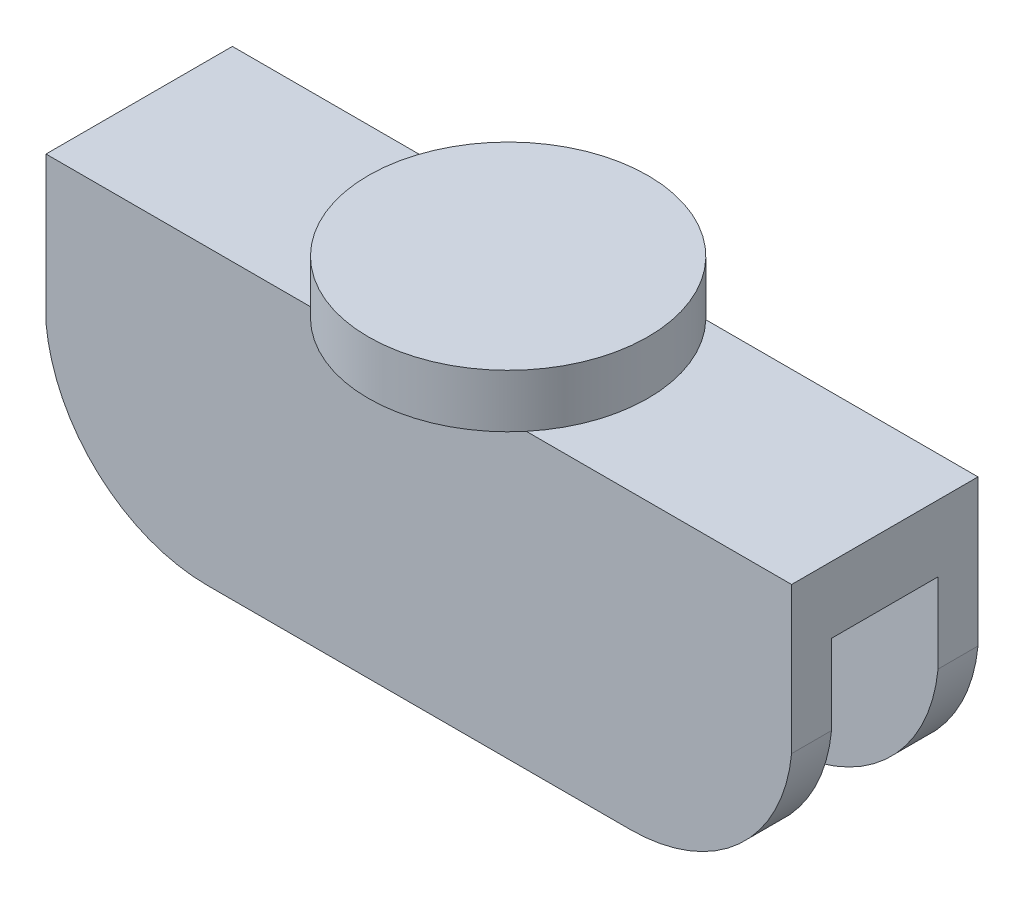
ISO-10303-21;
HEADER;
FILE_DESCRIPTION(('STEP AP214'),'2;1');
FILE_NAME('part.step','',(''),(''),'','','');
FILE_SCHEMA(('AUTOMOTIVE_DESIGN { 1 0 10303 214 1 1 1 1 }'));
ENDSEC;
DATA;
#1=APPLICATION_CONTEXT('core data for automotive mechanical design processes');
#2=APPLICATION_PROTOCOL_DEFINITION('international standard','automotive_design',2000,#1);
#3=PRODUCT_CONTEXT('',#1,'mechanical');
#4=PRODUCT('Part','Part','',(#3));
#5=PRODUCT_RELATED_PRODUCT_CATEGORY('part','',(#4));
#6=PRODUCT_DEFINITION_FORMATION('','',#4);
#7=PRODUCT_DEFINITION_CONTEXT('part definition',#1,'design');
#8=PRODUCT_DEFINITION('design','',#6,#7);
#9=PRODUCT_DEFINITION_SHAPE('','',#8);
#10=(LENGTH_UNIT() NAMED_UNIT(*) SI_UNIT(.MILLI.,.METRE.));
#11=(NAMED_UNIT(*) PLANE_ANGLE_UNIT() SI_UNIT($,.RADIAN.));
#12=(NAMED_UNIT(*) SI_UNIT($,.STERADIAN.) SOLID_ANGLE_UNIT());
#13=UNCERTAINTY_MEASURE_WITH_UNIT(LENGTH_MEASURE(1.E-05),#10,'distance_accuracy_value','');
#14=(GEOMETRIC_REPRESENTATION_CONTEXT(3) GLOBAL_UNCERTAINTY_ASSIGNED_CONTEXT((#13)) GLOBAL_UNIT_ASSIGNED_CONTEXT((#10,
#11,#12)) REPRESENTATION_CONTEXT('',''));
#15=CARTESIAN_POINT('',(0.,0.,0.));
#16=DIRECTION('',(0.,0.,1.));
#17=DIRECTION('',(1.,0.,0.));
#18=AXIS2_PLACEMENT_3D('',#15,#16,#17);
#19=CARTESIAN_POINT('',(-70.,-27.5,35.));
#20=DIRECTION('',(0.,1.,0.));
#21=DIRECTION('',(0.,0.,1.));
#22=AXIS2_PLACEMENT_3D('',#19,#20,#21);
#23=PLANE('',#22);
#24=DIRECTION('',(0.,0.,1.));
#25=VECTOR('',#24,1.);
#26=CARTESIAN_POINT('',(39.6838083738107,-27.5,-85.));
#27=LINE('',#26,#25);
#28=CARTESIAN_POINT('',(39.6838083738107,-27.5,0.));
#29=VERTEX_POINT('',#28);
#30=CARTESIAN_POINT('',(39.6838083738107,-27.5,7.49999999999998));
#31=VERTEX_POINT('',#30);
#32=EDGE_CURVE('E192',#29,#31,#27,.T.);
#33=ORIENTED_EDGE('',*,*,#32,.T.);
#34=DIRECTION('',(-1.,0.,0.));
#35=VECTOR('',#34,1.);
#36=CARTESIAN_POINT('',(-70.,-27.5,7.5));
#37=LINE('',#36,#35);
#38=CARTESIAN_POINT('',(-39.6838083738107,-27.5,7.49999999999999));
#39=VERTEX_POINT('',#38);
#40=EDGE_CURVE('E144',#31,#39,#37,.T.);
#41=ORIENTED_EDGE('',*,*,#40,.T.);
#42=DIRECTION('',(0.,0.,1.));
#43=VECTOR('',#42,1.);
#44=CARTESIAN_POINT('',(-39.6838083738107,-27.5,-85.));
#45=LINE('',#44,#43);
#46=CARTESIAN_POINT('',(-39.6838083738107,-27.5,0.));
#47=VERTEX_POINT('',#46);
#48=EDGE_CURVE('E200',#47,#39,#45,.T.);
#49=ORIENTED_EDGE('',*,*,#48,.F.);
#50=DIRECTION('',(1.,0.,0.));
#51=VECTOR('',#50,1.);
#52=CARTESIAN_POINT('',(-70.,-27.5,0.));
#53=LINE('',#52,#51);
#54=EDGE_CURVE('E206',#47,#29,#53,.T.);
#55=ORIENTED_EDGE('',*,*,#54,.T.);
#56=EDGE_LOOP('',(#33,#41,#49,#55));
#57=FACE_BOUND('',#56,.T.);
#58=ADVANCED_FACE('F34',(#57),#23,.F.);
#59=CARTESIAN_POINT('',(-39.6838083738107,2.96039044937877,-85.));
#60=DIRECTION('',(0.,0.,1.));
#61=DIRECTION('',(1.,0.,0.));
#62=AXIS2_PLACEMENT_3D('',#59,#60,#61);
#63=CYLINDRICAL_SURFACE('',#62,30.4603904493788);
#64=ORIENTED_EDGE('',*,*,#48,.T.);
#65=CARTESIAN_POINT('',(-39.6838083738107,2.96039044937877,7.49999999999999));
#66=DIRECTION('',(0.,0.,-1.));
#67=DIRECTION('',(-1.,0.,0.));
#68=AXIS2_PLACEMENT_3D('',#65,#66,#67);
#69=CIRCLE('',#68,30.4603904493788);
#70=CARTESIAN_POINT('',(-70.,1.22298005056365E-13,7.5));
#71=VERTEX_POINT('',#70);
#72=EDGE_CURVE('E171',#39,#71,#69,.T.);
#73=ORIENTED_EDGE('',*,*,#72,.T.);
#74=DIRECTION('',(0.,0.,1.));
#75=VECTOR('',#74,1.);
#76=CARTESIAN_POINT('',(-70.,0.,-85.));
#77=LINE('',#76,#75);
#78=CARTESIAN_POINT('',(-70.,0.,0.));
#79=VERTEX_POINT('',#78);
#80=EDGE_CURVE('E186',#79,#71,#77,.T.);
#81=ORIENTED_EDGE('',*,*,#80,.F.);
#82=CARTESIAN_POINT('',(-39.6838083738107,2.96039044937877,0.));
#83=DIRECTION('',(0.,0.,1.));
#84=DIRECTION('',(1.,0.,0.));
#85=AXIS2_PLACEMENT_3D('',#82,#83,#84);
#86=CIRCLE('',#85,30.4603904493788);
#87=EDGE_CURVE('E232',#47,#79,#86,.F.);
#88=ORIENTED_EDGE('',*,*,#87,.F.);
#89=EDGE_LOOP('',(#64,#73,#81,#88));
#90=FACE_BOUND('',#89,.T.);
#91=ADVANCED_FACE('F283',(#90),#63,.T.);
#92=CARTESIAN_POINT('',(39.6838083738107,2.96039044937877,-85.));
#93=DIRECTION('',(0.,0.,1.));
#94=DIRECTION('',(1.,0.,0.));
#95=AXIS2_PLACEMENT_3D('',#92,#93,#94);
#96=CYLINDRICAL_SURFACE('',#95,30.4603904493788);
#97=CARTESIAN_POINT('',(39.6838083738107,2.96039044937877,7.49999999999998));
#98=DIRECTION('',(0.,0.,-1.));
#99=DIRECTION('',(-1.,0.,0.));
#100=AXIS2_PLACEMENT_3D('',#97,#98,#99);
#101=CIRCLE('',#100,30.4603904493788);
#102=CARTESIAN_POINT('',(70.,0.,7.49999999999998));
#103=VERTEX_POINT('',#102);
#104=EDGE_CURVE('E11',#31,#103,#101,.F.);
#105=ORIENTED_EDGE('',*,*,#104,.F.);
#106=ORIENTED_EDGE('',*,*,#32,.F.);
#107=CARTESIAN_POINT('',(39.6838083738107,2.96039044937877,0.));
#108=DIRECTION('',(0.,0.,1.));
#109=DIRECTION('',(1.,0.,0.));
#110=AXIS2_PLACEMENT_3D('',#107,#108,#109);
#111=CIRCLE('',#110,30.4603904493788);
#112=CARTESIAN_POINT('',(70.,0.,0.));
#113=VERTEX_POINT('',#112);
#114=EDGE_CURVE('E235',#29,#113,#111,.T.);
#115=ORIENTED_EDGE('',*,*,#114,.T.);
#116=DIRECTION('',(0.,0.,1.));
#117=VECTOR('',#116,1.);
#118=CARTESIAN_POINT('',(70.,0.,-85.));
#119=LINE('',#118,#117);
#120=EDGE_CURVE('E187',#113,#103,#119,.T.);
#121=ORIENTED_EDGE('',*,*,#120,.T.);
#122=EDGE_LOOP('',(#105,#106,#115,#121));
#123=FACE_BOUND('',#122,.T.);
#124=ADVANCED_FACE('F291',(#123),#96,.T.);
#125=CARTESIAN_POINT('',(-70.,27.5,35.));
#126=DIRECTION('',(0.,-1.,0.));
#127=DIRECTION('',(0.,0.,-1.));
#128=AXIS2_PLACEMENT_3D('',#125,#126,#127);
#129=PLANE('',#128);
#130=CARTESIAN_POINT('',(0.,27.5,18.2249987052217));
#131=DIRECTION('',(0.,1.,0.));
#132=DIRECTION('',(0.,0.,1.));
#133=AXIS2_PLACEMENT_3D('',#130,#131,#132);
#134=CIRCLE('',#133,26.25);
#135=CARTESIAN_POINT('',(20.1906372252137,27.5,35.));
#136=VERTEX_POINT('',#135);
#137=CARTESIAN_POINT('',(18.8921126980195,27.5,0.));
#138=VERTEX_POINT('',#137);
#139=EDGE_CURVE('E57',#136,#138,#134,.T.);
#140=ORIENTED_EDGE('',*,*,#139,.F.);
#141=DIRECTION('',(-1.,0.,0.));
#142=VECTOR('',#141,1.);
#143=CARTESIAN_POINT('',(-70.,27.5,35.));
#144=LINE('',#143,#142);
#145=CARTESIAN_POINT('',(70.,27.5,35.));
#146=VERTEX_POINT('',#145);
#147=EDGE_CURVE('E207',#146,#136,#144,.T.);
#148=ORIENTED_EDGE('',*,*,#147,.F.);
#149=DIRECTION('',(0.,0.,-1.));
#150=VECTOR('',#149,1.);
#151=CARTESIAN_POINT('',(70.,27.5,35.));
#152=LINE('',#151,#150);
#153=CARTESIAN_POINT('',(70.,27.5,0.));
#154=VERTEX_POINT('',#153);
#155=EDGE_CURVE('E229',#146,#154,#152,.T.);
#156=ORIENTED_EDGE('',*,*,#155,.T.);
#157=DIRECTION('',(-1.,0.,0.));
#158=VECTOR('',#157,1.);
#159=CARTESIAN_POINT('',(-70.,27.5,0.));
#160=LINE('',#159,#158);
#161=EDGE_CURVE('E219',#154,#138,#160,.T.);
#162=ORIENTED_EDGE('',*,*,#161,.T.);
#163=EDGE_LOOP('',(#140,#148,#156,#162));
#164=FACE_BOUND('',#163,.T.);
#165=ADVANCED_FACE('F274',(#164),#129,.F.);
#166=CARTESIAN_POINT('',(70.,27.5,35.));
#167=DIRECTION('',(-1.,0.,0.));
#168=DIRECTION('',(0.,0.,1.));
#169=AXIS2_PLACEMENT_3D('',#166,#167,#168);
#170=PLANE('',#169);
#171=DIRECTION('',(0.,0.,-1.));
#172=VECTOR('',#171,1.);
#173=CARTESIAN_POINT('',(70.,15.,7.49999999999998));
#174=LINE('',#173,#172);
#175=CARTESIAN_POINT('',(70.,15.,27.5));
#176=VERTEX_POINT('',#175);
#177=CARTESIAN_POINT('',(70.,15.,7.49999999999998));
#178=VERTEX_POINT('',#177);
#179=EDGE_CURVE('E152',#176,#178,#174,.T.);
#180=ORIENTED_EDGE('',*,*,#179,.T.);
#181=DIRECTION('',(0.,1.,0.));
#182=VECTOR('',#181,1.);
#183=CARTESIAN_POINT('',(70.,-27.5,7.49999999999998));
#184=LINE('',#183,#182);
#185=EDGE_CURVE('E167',#103,#178,#184,.T.);
#186=ORIENTED_EDGE('',*,*,#185,.F.);
#187=ORIENTED_EDGE('',*,*,#120,.F.);
#188=DIRECTION('',(0.,1.,0.));
#189=VECTOR('',#188,1.);
#190=CARTESIAN_POINT('',(70.,27.5,0.));
#191=LINE('',#190,#189);
#192=EDGE_CURVE('E190',#113,#154,#191,.T.);
#193=ORIENTED_EDGE('',*,*,#192,.T.);
#194=ORIENTED_EDGE('',*,*,#155,.F.);
#195=DIRECTION('',(0.,1.,0.));
#196=VECTOR('',#195,1.);
#197=CARTESIAN_POINT('',(70.,27.5,35.));
#198=LINE('',#197,#196);
#199=CARTESIAN_POINT('',(70.,0.,35.));
#200=VERTEX_POINT('',#199);
#201=EDGE_CURVE('E203',#200,#146,#198,.T.);
#202=ORIENTED_EDGE('',*,*,#201,.F.);
#203=CARTESIAN_POINT('',(70.,0.,27.5));
#204=VERTEX_POINT('',#203);
#205=EDGE_CURVE('E191',#204,#200,#119,.T.);
#206=ORIENTED_EDGE('',*,*,#205,.F.);
#207=DIRECTION('',(0.,1.,0.));
#208=VECTOR('',#207,1.);
#209=CARTESIAN_POINT('',(70.,-27.5,27.5));
#210=LINE('',#209,#208);
#211=EDGE_CURVE('E49',#204,#176,#210,.T.);
#212=ORIENTED_EDGE('',*,*,#211,.T.);
#213=EDGE_LOOP('',(#180,#186,#187,#193,#194,#202,#206,#212));
#214=FACE_BOUND('',#213,.T.);
#215=ADVANCED_FACE('F36',(#214),#170,.F.);
#216=CARTESIAN_POINT('',(0.,0.,35.));
#217=DIRECTION('',(0.,0.,1.));
#218=DIRECTION('',(1.,0.,0.));
#219=AXIS2_PLACEMENT_3D('',#216,#217,#218);
#220=PLANE('',#219);
#221=DIRECTION('',(1.,0.,0.));
#222=VECTOR('',#221,1.);
#223=CARTESIAN_POINT('',(-70.,-27.5,35.));
#224=LINE('',#223,#222);
#225=CARTESIAN_POINT('',(-39.6838083738107,-27.5,35.));
#226=VERTEX_POINT('',#225);
#227=CARTESIAN_POINT('',(39.6838083738107,-27.5,35.));
#228=VERTEX_POINT('',#227);
#229=EDGE_CURVE('E213',#226,#228,#224,.T.);
#230=ORIENTED_EDGE('',*,*,#229,.T.);
#231=CARTESIAN_POINT('',(39.6838083738107,2.96039044937877,35.));
#232=DIRECTION('',(0.,0.,1.));
#233=DIRECTION('',(1.,0.,0.));
#234=AXIS2_PLACEMENT_3D('',#231,#232,#233);
#235=CIRCLE('',#234,30.4603904493788);
#236=EDGE_CURVE('E182',#228,#200,#235,.T.);
#237=ORIENTED_EDGE('',*,*,#236,.T.);
#238=ORIENTED_EDGE('',*,*,#201,.T.);
#239=ORIENTED_EDGE('',*,*,#147,.T.);
#240=CARTESIAN_POINT('',(-20.1906372252137,27.5,35.));
#241=VERTEX_POINT('',#240);
#242=EDGE_CURVE('E210',#136,#241,#144,.T.);
#243=ORIENTED_EDGE('',*,*,#242,.T.);
#244=CARTESIAN_POINT('',(-70.,27.5,35.));
#245=VERTEX_POINT('',#244);
#246=EDGE_CURVE('E205',#241,#245,#144,.T.);
#247=ORIENTED_EDGE('',*,*,#246,.T.);
#248=DIRECTION('',(0.,-1.,0.));
#249=VECTOR('',#248,1.);
#250=CARTESIAN_POINT('',(-70.,27.5,35.));
#251=LINE('',#250,#249);
#252=CARTESIAN_POINT('',(-70.,0.,35.));
#253=VERTEX_POINT('',#252);
#254=EDGE_CURVE('E209',#245,#253,#251,.T.);
#255=ORIENTED_EDGE('',*,*,#254,.T.);
#256=CARTESIAN_POINT('',(-39.6838083738107,2.96039044937877,35.));
#257=DIRECTION('',(0.,0.,1.));
#258=DIRECTION('',(1.,0.,0.));
#259=AXIS2_PLACEMENT_3D('',#256,#257,#258);
#260=CIRCLE('',#259,30.4603904493788);
#261=EDGE_CURVE('E178',#226,#253,#260,.F.);
#262=ORIENTED_EDGE('',*,*,#261,.F.);
#263=EDGE_LOOP('',(#230,#237,#238,#239,#243,#247,#255,#262));
#264=FACE_BOUND('',#263,.T.);
#265=ADVANCED_FACE('F250',(#264),#220,.T.);
#266=CARTESIAN_POINT('',(0.,0.,0.));
#267=DIRECTION('',(0.,0.,1.));
#268=DIRECTION('',(1.,0.,0.));
#269=AXIS2_PLACEMENT_3D('',#266,#267,#268);
#270=PLANE('',#269);
#271=ORIENTED_EDGE('',*,*,#114,.F.);
#272=ORIENTED_EDGE('',*,*,#54,.F.);
#273=ORIENTED_EDGE('',*,*,#87,.T.);
#274=DIRECTION('',(0.,-1.,0.));
#275=VECTOR('',#274,1.);
#276=CARTESIAN_POINT('',(-70.,27.5,0.));
#277=LINE('',#276,#275);
#278=CARTESIAN_POINT('',(-70.,27.5,0.));
#279=VERTEX_POINT('',#278);
#280=EDGE_CURVE('E221',#279,#79,#277,.T.);
#281=ORIENTED_EDGE('',*,*,#280,.F.);
#282=CARTESIAN_POINT('',(-18.8921126980195,27.5,0.));
#283=VERTEX_POINT('',#282);
#284=EDGE_CURVE('E218',#283,#279,#160,.T.);
#285=ORIENTED_EDGE('',*,*,#284,.F.);
#286=EDGE_CURVE('E222',#138,#283,#160,.T.);
#287=ORIENTED_EDGE('',*,*,#286,.F.);
#288=ORIENTED_EDGE('',*,*,#161,.F.);
#289=ORIENTED_EDGE('',*,*,#192,.F.);
#290=EDGE_LOOP('',(#271,#272,#273,#281,#285,#287,#288,#289));
#291=FACE_BOUND('',#290,.T.);
#292=ADVANCED_FACE('F280',(#291),#270,.F.);
#293=EDGE_CURVE('E181',#283,#241,#134,.T.);
#294=ORIENTED_EDGE('',*,*,#293,.F.);
#295=ORIENTED_EDGE('',*,*,#284,.T.);
#296=DIRECTION('',(0.,0.,-1.));
#297=VECTOR('',#296,1.);
#298=CARTESIAN_POINT('',(-70.,27.5,35.));
#299=LINE('',#298,#297);
#300=EDGE_CURVE('E216',#245,#279,#299,.T.);
#301=ORIENTED_EDGE('',*,*,#300,.F.);
#302=ORIENTED_EDGE('',*,*,#246,.F.);
#303=EDGE_LOOP('',(#294,#295,#301,#302));
#304=FACE_BOUND('',#303,.T.);
#305=ADVANCED_FACE('F254',(#304),#129,.F.);
#306=CARTESIAN_POINT('',(-70.,27.5,35.));
#307=DIRECTION('',(1.,0.,0.));
#308=DIRECTION('',(0.,0.,-1.));
#309=AXIS2_PLACEMENT_3D('',#306,#307,#308);
#310=PLANE('',#309);
#311=ORIENTED_EDGE('',*,*,#80,.T.);
#312=DIRECTION('',(0.,1.,0.));
#313=VECTOR('',#312,1.);
#314=CARTESIAN_POINT('',(-70.,-27.5,7.5));
#315=LINE('',#314,#313);
#316=CARTESIAN_POINT('',(-70.,15.,7.5));
#317=VERTEX_POINT('',#316);
#318=EDGE_CURVE('E157',#71,#317,#315,.T.);
#319=ORIENTED_EDGE('',*,*,#318,.T.);
#320=DIRECTION('',(0.,0.,1.));
#321=VECTOR('',#320,1.);
#322=CARTESIAN_POINT('',(-70.,15.,7.5));
#323=LINE('',#322,#321);
#324=CARTESIAN_POINT('',(-70.,15.,27.5));
#325=VERTEX_POINT('',#324);
#326=EDGE_CURVE('E149',#317,#325,#323,.T.);
#327=ORIENTED_EDGE('',*,*,#326,.T.);
#328=DIRECTION('',(0.,1.,0.));
#329=VECTOR('',#328,1.);
#330=CARTESIAN_POINT('',(-70.,-27.5,27.5));
#331=LINE('',#330,#329);
#332=CARTESIAN_POINT('',(-70.,0.,27.5));
#333=VERTEX_POINT('',#332);
#334=EDGE_CURVE('E135',#333,#325,#331,.T.);
#335=ORIENTED_EDGE('',*,*,#334,.F.);
#336=EDGE_CURVE('E199',#333,#253,#77,.T.);
#337=ORIENTED_EDGE('',*,*,#336,.T.);
#338=ORIENTED_EDGE('',*,*,#254,.F.);
#339=ORIENTED_EDGE('',*,*,#300,.T.);
#340=ORIENTED_EDGE('',*,*,#280,.T.);
#341=EDGE_LOOP('',(#311,#319,#327,#335,#337,#338,#339,#340));
#342=FACE_BOUND('',#341,.T.);
#343=ADVANCED_FACE('F156',(#342),#310,.F.);
#344=CARTESIAN_POINT('',(-39.6838083738107,-27.5,27.5));
#345=VERTEX_POINT('',#344);
#346=EDGE_CURVE('E197',#345,#226,#45,.T.);
#347=ORIENTED_EDGE('',*,*,#346,.F.);
#348=DIRECTION('',(1.,0.,0.));
#349=VECTOR('',#348,1.);
#350=CARTESIAN_POINT('',(-70.,-27.5,27.5));
#351=LINE('',#350,#349);
#352=CARTESIAN_POINT('',(39.6838083738107,-27.5,27.5));
#353=VERTEX_POINT('',#352);
#354=EDGE_CURVE('E165',#345,#353,#351,.T.);
#355=ORIENTED_EDGE('',*,*,#354,.T.);
#356=EDGE_CURVE('E185',#353,#228,#27,.T.);
#357=ORIENTED_EDGE('',*,*,#356,.T.);
#358=ORIENTED_EDGE('',*,*,#229,.F.);
#359=EDGE_LOOP('',(#347,#355,#357,#358));
#360=FACE_BOUND('',#359,.T.);
#361=ADVANCED_FACE('F262',(#360),#23,.F.);
#362=ORIENTED_EDGE('',*,*,#336,.F.);
#363=CARTESIAN_POINT('',(-39.6838083738107,2.96039044937877,27.5));
#364=DIRECTION('',(0.,0.,1.));
#365=DIRECTION('',(1.,0.,0.));
#366=AXIS2_PLACEMENT_3D('',#363,#364,#365);
#367=CIRCLE('',#366,30.4603904493788);
#368=EDGE_CURVE('E140',#333,#345,#367,.T.);
#369=ORIENTED_EDGE('',*,*,#368,.T.);
#370=ORIENTED_EDGE('',*,*,#346,.T.);
#371=ORIENTED_EDGE('',*,*,#261,.T.);
#372=EDGE_LOOP('',(#362,#369,#370,#371));
#373=FACE_BOUND('',#372,.T.);
#374=ADVANCED_FACE('F258',(#373),#63,.T.);
#375=CARTESIAN_POINT('',(39.6838083738107,2.96039044937877,27.5));
#376=DIRECTION('',(0.,0.,1.));
#377=DIRECTION('',(1.,0.,0.));
#378=AXIS2_PLACEMENT_3D('',#375,#376,#377);
#379=CIRCLE('',#378,30.4603904493788);
#380=EDGE_CURVE('E42',#204,#353,#379,.F.);
#381=ORIENTED_EDGE('',*,*,#380,.F.);
#382=ORIENTED_EDGE('',*,*,#205,.T.);
#383=ORIENTED_EDGE('',*,*,#236,.F.);
#384=ORIENTED_EDGE('',*,*,#356,.F.);
#385=EDGE_LOOP('',(#381,#382,#383,#384));
#386=FACE_BOUND('',#385,.T.);
#387=ADVANCED_FACE('F266',(#386),#96,.T.);
#388=CARTESIAN_POINT('',(0.,27.5,18.2249987052217));
#389=DIRECTION('',(0.,1.,0.));
#390=DIRECTION('',(0.,0.,1.));
#391=AXIS2_PLACEMENT_3D('',#388,#389,#390);
#392=PLANE('',#391);
#393=EDGE_CURVE('E180',#138,#283,#134,.T.);
#394=ORIENTED_EDGE('',*,*,#393,.F.);
#395=ORIENTED_EDGE('',*,*,#286,.T.);
#396=EDGE_LOOP('',(#394,#395));
#397=FACE_BOUND('',#396,.T.);
#398=ADVANCED_FACE('F278',(#397),#392,.F.);
#399=CARTESIAN_POINT('',(0.,37.5,18.2249987052217));
#400=DIRECTION('',(0.,-1.,0.));
#401=DIRECTION('',(0.,0.,-1.));
#402=AXIS2_PLACEMENT_3D('',#399,#400,#401);
#403=CYLINDRICAL_SURFACE('',#402,26.25);
#404=CARTESIAN_POINT('',(0.,37.5,18.2249987052217));
#405=DIRECTION('',(0.,1.,0.));
#406=DIRECTION('',(0.,0.,1.));
#407=AXIS2_PLACEMENT_3D('',#404,#405,#406);
#408=CIRCLE('',#407,26.25);
#409=CARTESIAN_POINT('',(0.,37.5,44.4749987052216));
#410=VERTEX_POINT('',#409);
#411=EDGE_CURVE('E175',#410,#410,#408,.T.);
#412=ORIENTED_EDGE('',*,*,#411,.F.);
#413=EDGE_LOOP('',(#412));
#414=FACE_BOUND('',#413,.T.);
#415=ORIENTED_EDGE('',*,*,#139,.T.);
#416=ORIENTED_EDGE('',*,*,#393,.T.);
#417=ORIENTED_EDGE('',*,*,#293,.T.);
#418=EDGE_CURVE('E174',#241,#136,#134,.T.);
#419=ORIENTED_EDGE('',*,*,#418,.T.);
#420=EDGE_LOOP('',(#415,#416,#417,#419));
#421=FACE_BOUND('',#420,.T.);
#422=ADVANCED_FACE('F243',(#414,#421),#403,.T.);
#423=CARTESIAN_POINT('',(0.,37.5,18.2249987052217));
#424=DIRECTION('',(0.,1.,0.));
#425=DIRECTION('',(0.,0.,1.));
#426=AXIS2_PLACEMENT_3D('',#423,#424,#425);
#427=PLANE('',#426);
#428=ORIENTED_EDGE('',*,*,#411,.T.);
#429=EDGE_LOOP('',(#428));
#430=FACE_BOUND('',#429,.T.);
#431=ADVANCED_FACE('F364',(#430),#427,.T.);
#432=ORIENTED_EDGE('',*,*,#242,.F.);
#433=ORIENTED_EDGE('',*,*,#418,.F.);
#434=EDGE_LOOP('',(#432,#433));
#435=FACE_BOUND('',#434,.T.);
#436=ADVANCED_FACE('F246',(#435),#392,.F.);
#437=CARTESIAN_POINT('',(-70.,-27.5,7.5));
#438=DIRECTION('',(0.,0.,-1.));
#439=DIRECTION('',(-1.,0.,0.));
#440=AXIS2_PLACEMENT_3D('',#437,#438,#439);
#441=PLANE('',#440);
#442=ORIENTED_EDGE('',*,*,#40,.F.);
#443=ORIENTED_EDGE('',*,*,#104,.T.);
#444=ORIENTED_EDGE('',*,*,#185,.T.);
#445=DIRECTION('',(-1.,0.,0.));
#446=VECTOR('',#445,1.);
#447=CARTESIAN_POINT('',(-70.,15.,7.5));
#448=LINE('',#447,#446);
#449=EDGE_CURVE('E163',#178,#317,#448,.T.);
#450=ORIENTED_EDGE('',*,*,#449,.T.);
#451=ORIENTED_EDGE('',*,*,#318,.F.);
#452=ORIENTED_EDGE('',*,*,#72,.F.);
#453=EDGE_LOOP('',(#442,#443,#444,#450,#451,#452));
#454=FACE_BOUND('',#453,.T.);
#455=ADVANCED_FACE('F287',(#454),#441,.F.);
#456=CARTESIAN_POINT('',(-70.,-27.5,27.5));
#457=DIRECTION('',(0.,0.,1.));
#458=DIRECTION('',(1.,0.,0.));
#459=AXIS2_PLACEMENT_3D('',#456,#457,#458);
#460=PLANE('',#459);
#461=ORIENTED_EDGE('',*,*,#334,.T.);
#462=DIRECTION('',(1.,0.,0.));
#463=VECTOR('',#462,1.);
#464=CARTESIAN_POINT('',(-70.,15.,27.5));
#465=LINE('',#464,#463);
#466=EDGE_CURVE('E138',#325,#176,#465,.T.);
#467=ORIENTED_EDGE('',*,*,#466,.T.);
#468=ORIENTED_EDGE('',*,*,#211,.F.);
#469=ORIENTED_EDGE('',*,*,#380,.T.);
#470=ORIENTED_EDGE('',*,*,#354,.F.);
#471=ORIENTED_EDGE('',*,*,#368,.F.);
#472=EDGE_LOOP('',(#461,#467,#468,#469,#470,#471));
#473=FACE_BOUND('',#472,.T.);
#474=ADVANCED_FACE('F137',(#473),#460,.F.);
#475=CARTESIAN_POINT('',(0.,15.,0.));
#476=DIRECTION('',(0.,1.,0.));
#477=DIRECTION('',(0.,0.,1.));
#478=AXIS2_PLACEMENT_3D('',#475,#476,#477);
#479=PLANE('',#478);
#480=ORIENTED_EDGE('',*,*,#326,.F.);
#481=ORIENTED_EDGE('',*,*,#449,.F.);
#482=ORIENTED_EDGE('',*,*,#179,.F.);
#483=ORIENTED_EDGE('',*,*,#466,.F.);
#484=EDGE_LOOP('',(#480,#481,#482,#483));
#485=FACE_BOUND('',#484,.T.);
#486=ADVANCED_FACE('F147',(#485),#479,.F.);
#487=CLOSED_SHELL('',(#58,#91,#124,#165,#215,#265,#292,#305,#343,#361,#374,#387,#398,#422,#431,
#436,#455,#474,#486));
#488=MANIFOLD_SOLID_BREP('B2',#487);
#489=ADVANCED_BREP_SHAPE_REPRESENTATION('',(#18,#488),#14);
#490=SHAPE_DEFINITION_REPRESENTATION(#9,#489);
ENDSEC;
END-ISO-10303-21;
